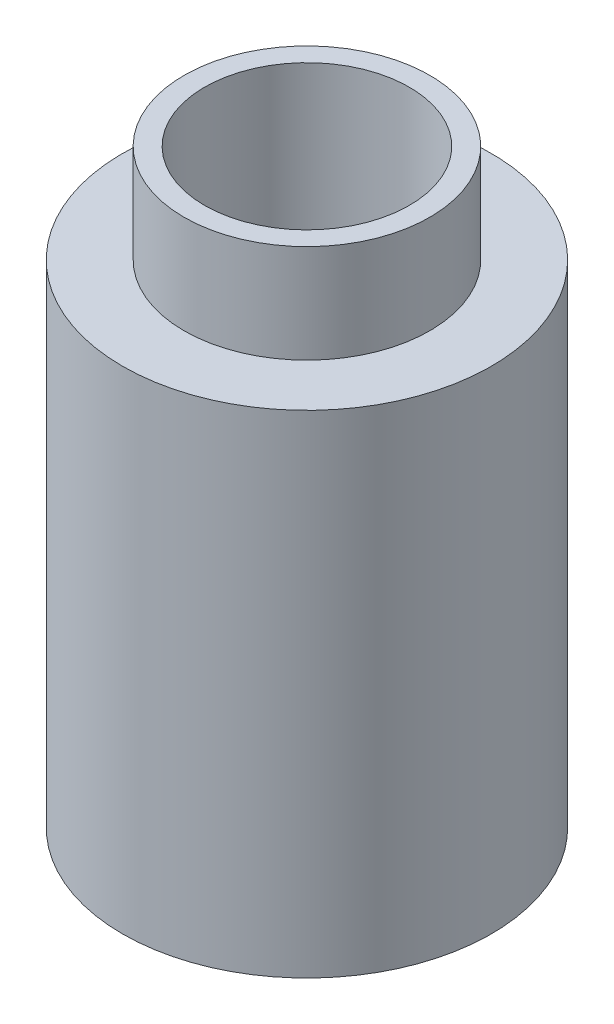
ISO-10303-21;
HEADER;
FILE_DESCRIPTION(('STEP AP214'),'2;1');
FILE_NAME('part.step','',(''),(''),'','','');
FILE_SCHEMA(('AUTOMOTIVE_DESIGN { 1 0 10303 214 1 1 1 1 }'));
ENDSEC;
DATA;
#1=APPLICATION_CONTEXT('core data for automotive mechanical design processes');
#2=APPLICATION_PROTOCOL_DEFINITION('international standard','automotive_design',2000,#1);
#3=PRODUCT_CONTEXT('',#1,'mechanical');
#4=PRODUCT('Part','Part','',(#3));
#5=PRODUCT_RELATED_PRODUCT_CATEGORY('part','',(#4));
#6=PRODUCT_DEFINITION_FORMATION('','',#4);
#7=PRODUCT_DEFINITION_CONTEXT('part definition',#1,'design');
#8=PRODUCT_DEFINITION('design','',#6,#7);
#9=PRODUCT_DEFINITION_SHAPE('','',#8);
#10=(LENGTH_UNIT() NAMED_UNIT(*) SI_UNIT(.MILLI.,.METRE.));
#11=(NAMED_UNIT(*) PLANE_ANGLE_UNIT() SI_UNIT($,.RADIAN.));
#12=(NAMED_UNIT(*) SI_UNIT($,.STERADIAN.) SOLID_ANGLE_UNIT());
#13=UNCERTAINTY_MEASURE_WITH_UNIT(LENGTH_MEASURE(1.E-05),#10,'distance_accuracy_value','');
#14=(GEOMETRIC_REPRESENTATION_CONTEXT(3) GLOBAL_UNCERTAINTY_ASSIGNED_CONTEXT((#13)) GLOBAL_UNIT_ASSIGNED_CONTEXT((#10,
#11,#12)) REPRESENTATION_CONTEXT('',''));
#15=CARTESIAN_POINT('',(0.,0.,0.));
#16=DIRECTION('',(0.,0.,1.));
#17=DIRECTION('',(1.,0.,0.));
#18=AXIS2_PLACEMENT_3D('',#15,#16,#17);
#19=CARTESIAN_POINT('',(0.,6.,0.));
#20=DIRECTION('',(0.,1.,0.));
#21=DIRECTION('',(0.,0.,1.));
#22=AXIS2_PLACEMENT_3D('',#19,#20,#21);
#23=PLANE('',#22);
#24=CARTESIAN_POINT('',(0.,6.,0.));
#25=DIRECTION('',(0.,1.,0.));
#26=DIRECTION('',(0.,0.,1.));
#27=AXIS2_PLACEMENT_3D('',#24,#25,#26);
#28=CIRCLE('',#27,2.25);
#29=CARTESIAN_POINT('',(0.,6.,2.25));
#30=VERTEX_POINT('',#29);
#31=EDGE_CURVE('E10',#30,#30,#28,.T.);
#32=ORIENTED_EDGE('',*,*,#31,.T.);
#33=EDGE_LOOP('',(#32));
#34=FACE_BOUND('',#33,.T.);
#35=CARTESIAN_POINT('',(0.,6.,0.));
#36=DIRECTION('',(0.,1.,0.));
#37=DIRECTION('',(0.,0.,1.));
#38=AXIS2_PLACEMENT_3D('',#35,#36,#37);
#39=CIRCLE('',#38,1.5);
#40=CARTESIAN_POINT('',(0.,6.,1.5));
#41=VERTEX_POINT('',#40);
#42=EDGE_CURVE('E55',#41,#41,#39,.T.);
#43=ORIENTED_EDGE('',*,*,#42,.F.);
#44=EDGE_LOOP('',(#43));
#45=FACE_BOUND('',#44,.T.);
#46=ADVANCED_FACE('F39',(#34,#45),#23,.T.);
#47=CARTESIAN_POINT('',(0.,0.,0.));
#48=DIRECTION('',(0.,1.,0.));
#49=DIRECTION('',(0.,0.,1.));
#50=AXIS2_PLACEMENT_3D('',#47,#48,#49);
#51=PLANE('',#50);
#52=CARTESIAN_POINT('',(0.,0.,0.));
#53=DIRECTION('',(0.,1.,0.));
#54=DIRECTION('',(0.,0.,1.));
#55=AXIS2_PLACEMENT_3D('',#52,#53,#54);
#56=CIRCLE('',#55,2.25);
#57=CARTESIAN_POINT('',(0.,0.,2.25));
#58=VERTEX_POINT('',#57);
#59=EDGE_CURVE('E43',#58,#58,#56,.T.);
#60=ORIENTED_EDGE('',*,*,#59,.F.);
#61=EDGE_LOOP('',(#60));
#62=FACE_BOUND('',#61,.T.);
#63=CARTESIAN_POINT('',(0.,0.,0.));
#64=DIRECTION('',(0.,1.,0.));
#65=DIRECTION('',(0.,0.,1.));
#66=AXIS2_PLACEMENT_3D('',#63,#64,#65);
#67=CIRCLE('',#66,1.25);
#68=CARTESIAN_POINT('',(0.,0.,1.25));
#69=VERTEX_POINT('',#68);
#70=EDGE_CURVE('E50',#69,#69,#67,.T.);
#71=ORIENTED_EDGE('',*,*,#70,.T.);
#72=EDGE_LOOP('',(#71));
#73=FACE_BOUND('',#72,.T.);
#74=ADVANCED_FACE('F80',(#62,#73),#51,.F.);
#75=CARTESIAN_POINT('',(0.,6.,0.));
#76=DIRECTION('',(0.,-1.,0.));
#77=DIRECTION('',(0.,0.,-1.));
#78=AXIS2_PLACEMENT_3D('',#75,#76,#77);
#79=CYLINDRICAL_SURFACE('',#78,2.25);
#80=ORIENTED_EDGE('',*,*,#31,.F.);
#81=EDGE_LOOP('',(#80));
#82=FACE_BOUND('',#81,.T.);
#83=ORIENTED_EDGE('',*,*,#59,.T.);
#84=EDGE_LOOP('',(#83));
#85=FACE_BOUND('',#84,.T.);
#86=ADVANCED_FACE('F41',(#82,#85),#79,.T.);
#87=CARTESIAN_POINT('',(0.,6.,0.));
#88=DIRECTION('',(0.,-1.,0.));
#89=DIRECTION('',(0.,0.,-1.));
#90=AXIS2_PLACEMENT_3D('',#87,#88,#89);
#91=CYLINDRICAL_SURFACE('',#90,1.25);
#92=ORIENTED_EDGE('',*,*,#70,.F.);
#93=EDGE_LOOP('',(#92));
#94=FACE_BOUND('',#93,.T.);
#95=CARTESIAN_POINT('',(0.,7.2,0.));
#96=DIRECTION('',(0.,1.,0.));
#97=DIRECTION('',(0.,0.,1.));
#98=AXIS2_PLACEMENT_3D('',#95,#96,#97);
#99=CIRCLE('',#98,1.25);
#100=CARTESIAN_POINT('',(0.,7.2,1.25));
#101=VERTEX_POINT('',#100);
#102=EDGE_CURVE('E58',#101,#101,#99,.T.);
#103=ORIENTED_EDGE('',*,*,#102,.T.);
#104=EDGE_LOOP('',(#103));
#105=FACE_BOUND('',#104,.T.);
#106=ADVANCED_FACE('F64',(#94,#105),#91,.F.);
#107=CARTESIAN_POINT('',(0.,7.2,0.));
#108=DIRECTION('',(0.,1.,0.));
#109=DIRECTION('',(0.,0.,1.));
#110=AXIS2_PLACEMENT_3D('',#107,#108,#109);
#111=PLANE('',#110);
#112=CARTESIAN_POINT('',(0.,7.2,0.));
#113=DIRECTION('',(0.,1.,0.));
#114=DIRECTION('',(0.,0.,1.));
#115=AXIS2_PLACEMENT_3D('',#112,#113,#114);
#116=CIRCLE('',#115,1.5);
#117=CARTESIAN_POINT('',(0.,7.2,1.5));
#118=VERTEX_POINT('',#117);
#119=EDGE_CURVE('E54',#118,#118,#116,.T.);
#120=ORIENTED_EDGE('',*,*,#119,.T.);
#121=EDGE_LOOP('',(#120));
#122=FACE_BOUND('',#121,.T.);
#123=ORIENTED_EDGE('',*,*,#102,.F.);
#124=EDGE_LOOP('',(#123));
#125=FACE_BOUND('',#124,.T.);
#126=ADVANCED_FACE('F66',(#122,#125),#111,.T.);
#127=CARTESIAN_POINT('',(0.,7.2,0.));
#128=DIRECTION('',(0.,-1.,0.));
#129=DIRECTION('',(0.,0.,-1.));
#130=AXIS2_PLACEMENT_3D('',#127,#128,#129);
#131=CYLINDRICAL_SURFACE('',#130,1.5);
#132=ORIENTED_EDGE('',*,*,#119,.F.);
#133=EDGE_LOOP('',(#132));
#134=FACE_BOUND('',#133,.T.);
#135=ORIENTED_EDGE('',*,*,#42,.T.);
#136=EDGE_LOOP('',(#135));
#137=FACE_BOUND('',#136,.T.);
#138=ADVANCED_FACE('F68',(#134,#137),#131,.T.);
#139=CLOSED_SHELL('',(#46,#74,#86,#106,#126,#138));
#140=MANIFOLD_SOLID_BREP('B2',#139);
#141=ADVANCED_BREP_SHAPE_REPRESENTATION('',(#18,#140),#14);
#142=SHAPE_DEFINITION_REPRESENTATION(#9,#141);
ENDSEC;
END-ISO-10303-21;
